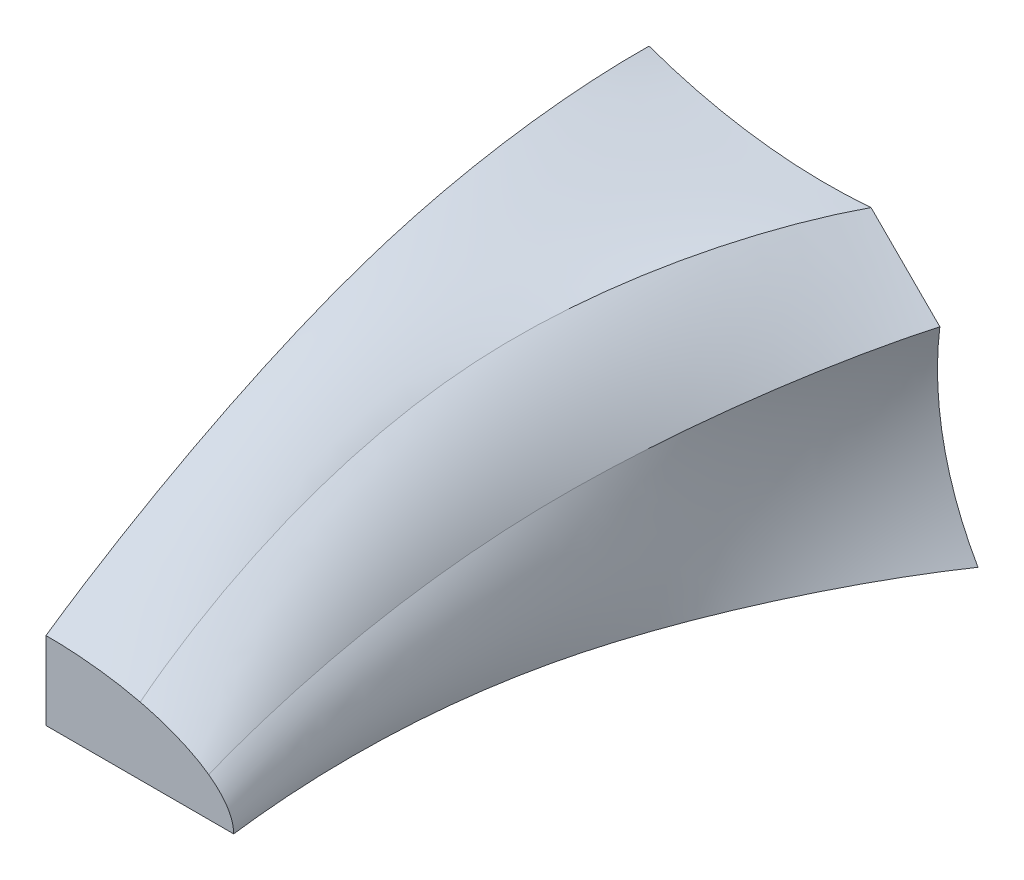
ISO-10303-21;
HEADER;
FILE_DESCRIPTION(('STEP AP214'),'2;1');
FILE_NAME('part.step','',(''),(''),'','','');
FILE_SCHEMA(('AUTOMOTIVE_DESIGN { 1 0 10303 214 1 1 1 1 }'));
ENDSEC;
DATA;
#1=APPLICATION_CONTEXT('core data for automotive mechanical design processes');
#2=APPLICATION_PROTOCOL_DEFINITION('international standard','automotive_design',2000,#1);
#3=PRODUCT_CONTEXT('',#1,'mechanical');
#4=PRODUCT('Part','Part','',(#3));
#5=PRODUCT_RELATED_PRODUCT_CATEGORY('part','',(#4));
#6=PRODUCT_DEFINITION_FORMATION('','',#4);
#7=PRODUCT_DEFINITION_CONTEXT('part definition',#1,'design');
#8=PRODUCT_DEFINITION('design','',#6,#7);
#9=PRODUCT_DEFINITION_SHAPE('','',#8);
#10=(LENGTH_UNIT() NAMED_UNIT(*) SI_UNIT(.MILLI.,.METRE.));
#11=(NAMED_UNIT(*) PLANE_ANGLE_UNIT() SI_UNIT($,.RADIAN.));
#12=(NAMED_UNIT(*) SI_UNIT($,.STERADIAN.) SOLID_ANGLE_UNIT());
#13=UNCERTAINTY_MEASURE_WITH_UNIT(LENGTH_MEASURE(1.E-05),#10,'distance_accuracy_value','');
#14=(GEOMETRIC_REPRESENTATION_CONTEXT(3) GLOBAL_UNCERTAINTY_ASSIGNED_CONTEXT((#13)) GLOBAL_UNIT_ASSIGNED_CONTEXT((#10,
#11,#12)) REPRESENTATION_CONTEXT('',''));
#15=CARTESIAN_POINT('',(0.,0.,0.));
#16=DIRECTION('',(0.,0.,1.));
#17=DIRECTION('',(1.,0.,0.));
#18=AXIS2_PLACEMENT_3D('',#15,#16,#17);
#19=CARTESIAN_POINT('',(0.,0.,82.55));
#20=DIRECTION('',(0.,0.,1.));
#21=DIRECTION('',(1.,0.,0.));
#22=AXIS2_PLACEMENT_3D('',#19,#20,#21);
#23=PLANE('',#22);
#24=DIRECTION('',(0.,-1.,0.));
#25=VECTOR('',#24,1.);
#26=CARTESIAN_POINT('',(0.,0.,82.55));
#27=LINE('',#26,#25);
#28=CARTESIAN_POINT('',(0.,10.6743821804045,82.55));
#29=VERTEX_POINT('',#28);
#30=CARTESIAN_POINT('',(0.,0.,82.55));
#31=VERTEX_POINT('',#30);
#32=EDGE_CURVE('E138',#29,#31,#27,.T.);
#33=ORIENTED_EDGE('',*,*,#32,.T.);
#34=DIRECTION('',(1.,0.,0.));
#35=VECTOR('',#34,1.);
#36=CARTESIAN_POINT('',(0.,0.,82.55));
#37=LINE('',#36,#35);
#38=CARTESIAN_POINT('',(25.6911417861589,0.,82.55));
#39=VERTEX_POINT('',#38);
#40=EDGE_CURVE('E218',#31,#39,#37,.T.);
#41=ORIENTED_EDGE('',*,*,#40,.T.);
#42=CARTESIAN_POINT('',(0.,0.,82.55));
#43=DIRECTION('',(0.,0.,1.));
#44=DIRECTION('',(1.,0.,0.));
#45=AXIS2_PLACEMENT_3D('',#42,#43,#44);
#46=ELLIPSE('',#45,25.6911417861589,10.6743821804045);
#47=CARTESIAN_POINT('',(22.2634632933464,5.32689996559936,82.55));
#48=VERTEX_POINT('',#47);
#49=EDGE_CURVE('E112',#39,#48,#46,.T.);
#50=ORIENTED_EDGE('',*,*,#49,.T.);
#51=CARTESIAN_POINT('',(12.8950605663748,9.23238389625349,82.55));
#52=VERTEX_POINT('',#51);
#53=EDGE_CURVE('E115',#48,#52,#46,.T.);
#54=ORIENTED_EDGE('',*,*,#53,.T.);
#55=EDGE_CURVE('E119',#52,#29,#46,.T.);
#56=ORIENTED_EDGE('',*,*,#55,.T.);
#57=EDGE_LOOP('',(#33,#41,#50,#54,#56));
#58=FACE_BOUND('',#57,.T.);
#59=ADVANCED_FACE('F66',(#58),#23,.T.);
#60=CARTESIAN_POINT('',(24.3319668312913,107.655299062586,0.));
#61=DIRECTION('',(0.,0.,1.));
#62=DIRECTION('',(1.,0.,0.));
#63=AXIS2_PLACEMENT_3D('',#60,#61,#62);
#64=PLANE('',#63);
#65=CARTESIAN_POINT('',(24.3319668312913,107.655299062586,0.));
#66=DIRECTION('',(0.,0.,-1.));
#67=DIRECTION('',(1.,0.,0.));
#68=AXIS2_PLACEMENT_3D('',#65,#66,#67);
#69=CIRCLE('',#68,72.5807472209943);
#70=CARTESIAN_POINT('',(30.3860838751481,35.3274860583401,0.));
#71=VERTEX_POINT('',#70);
#72=CARTESIAN_POINT('',(0.,39.2745981501295,0.));
#73=VERTEX_POINT('',#72);
#74=EDGE_CURVE('E166',#71,#73,#69,.T.);
#75=ORIENTED_EDGE('',*,*,#74,.F.);
#76=DIRECTION('',(-0.70708390454535,0.707129657087654,0.));
#77=VECTOR('',#76,1.);
#78=CARTESIAN_POINT('',(30.3860838751481,35.3274860583401,0.));
#79=LINE('',#78,#77);
#80=CARTESIAN_POINT('',(39.8062561381852,25.9067042540206,0.));
#81=VERTEX_POINT('',#80);
#82=EDGE_CURVE('E144',#81,#71,#79,.T.);
#83=ORIENTED_EDGE('',*,*,#82,.F.);
#84=CARTESIAN_POINT('',(80.89226061745,20.7088529487753,0.));
#85=DIRECTION('',(0.,0.,-1.));
#86=DIRECTION('',(1.,0.,0.));
#87=AXIS2_PLACEMENT_3D('',#84,#85,#86);
#88=CIRCLE('',#87,41.4134932390592);
#89=CARTESIAN_POINT('',(45.028339585198,0.,0.));
#90=VERTEX_POINT('',#89);
#91=EDGE_CURVE('E250',#90,#81,#88,.T.);
#92=ORIENTED_EDGE('',*,*,#91,.F.);
#93=DIRECTION('',(1.,0.,0.));
#94=VECTOR('',#93,1.);
#95=CARTESIAN_POINT('',(0.,0.,0.));
#96=LINE('',#95,#94);
#97=CARTESIAN_POINT('',(0.,0.,0.));
#98=VERTEX_POINT('',#97);
#99=EDGE_CURVE('E77',#98,#90,#96,.T.);
#100=ORIENTED_EDGE('',*,*,#99,.F.);
#101=DIRECTION('',(0.,-1.,0.));
#102=VECTOR('',#101,1.);
#103=CARTESIAN_POINT('',(0.,0.,0.));
#104=LINE('',#103,#102);
#105=EDGE_CURVE('E12',#73,#98,#104,.T.);
#106=ORIENTED_EDGE('',*,*,#105,.F.);
#107=EDGE_LOOP('',(#75,#83,#92,#100,#106));
#108=FACE_BOUND('',#107,.T.);
#109=ADVANCED_FACE('F286',(#108),#64,.F.);
#110=CARTESIAN_POINT('',(45.028339585198,0.,0.));
#111=CARTESIAN_POINT('',(39.4516631415439,0.,8.05703448881319));
#112=CARTESIAN_POINT('',(22.5126293143968,0.,40.7797738145076));
#113=CARTESIAN_POINT('',(24.411620408958,0.,72.2625900443687));
#114=CARTESIAN_POINT('',(25.6911417861589,0.,82.55));
#115=CARTESIAN_POINT('',(40.5052113873424,7.83322537988466,0.));
#116=CARTESIAN_POINT('',(35.1109059369786,7.13140363113995,8.08520068010766));
#117=CARTESIAN_POINT('',(25.0073824724487,6.13449248923007,40.7512994144839));
#118=CARTESIAN_POINT('',(24.461072516752,2.69226909411327,72.2907562356632));
#119=CARTESIAN_POINT('',(25.6911417861589,1.86966089556751,82.55));
#120=CARTESIAN_POINT('',(38.6709664210207,16.9328964889519,0.));
#121=CARTESIAN_POINT('',(33.4590319639472,15.5292529914625,8.11336687140213));
#122=CARTESIAN_POINT('',(24.0191103565009,11.3599865003393,40.7228250144602));
#123=CARTESIAN_POINT('',(23.3284611073887,5.35190317536194,72.3189224269577));
#124=CARTESIAN_POINT('',(24.5090782690018,3.70668677827042,82.55));
#125=CARTESIAN_POINT('',(39.8062561381852,25.9067042540206,0.));
#126=CARTESIAN_POINT('',(34.7766926744019,23.8012390077865,8.1415330626966));
#127=CARTESIAN_POINT('',(19.5652344951222,15.4953193402274,40.6943506144365));
#128=CARTESIAN_POINT('',(21.1322982395273,7.79472456123665,72.3470886182521));
#129=CARTESIAN_POINT('',(22.2634632933464,5.32689996559936,82.55));
#130=B_SPLINE_SURFACE_WITH_KNOTS('',3,3,((#110,#111,#112,#113,#114),(#115,#116,#117,#118,#119),
(#120,#121,#122,#123,#124),(#125,#126,#127,#128,#129)),.UNSPECIFIED.,.F.,.F.,.F.,(4,4),(4,1,4),
(0.,1.),(0.,0.463116800946352,1.),.UNSPECIFIED.);
#131=CARTESIAN_POINT('',(39.8062561381852,25.9067042540206,0.));
#132=CARTESIAN_POINT('',(34.7766926744019,23.8012390077865,8.1415330626966));
#133=CARTESIAN_POINT('',(19.5652344951222,15.4953193402274,40.6943506144365));
#134=CARTESIAN_POINT('',(21.1322982395273,7.79472456123665,72.3470886182521));
#135=CARTESIAN_POINT('',(22.2634632933464,5.32689996559936,82.55));
#136=B_SPLINE_CURVE_WITH_KNOTS('',3,(#131,#132,#133,#134,#135),.UNSPECIFIED.,.F.,.F.,(4,1,4),
(0.,0.463116800946352,1.),.UNSPECIFIED.);
#137=EDGE_CURVE('E149',#81,#48,#136,.T.);
#138=CARTESIAN_POINT('',(45.028339585198,0.,0.));
#139=CARTESIAN_POINT('',(39.4516631415439,0.,8.05703448881319));
#140=CARTESIAN_POINT('',(22.5126293143968,0.,40.7797738145076));
#141=CARTESIAN_POINT('',(24.411620408958,0.,72.2625900443687));
#142=CARTESIAN_POINT('',(25.6911417861589,0.,82.55));
#143=B_SPLINE_CURVE_WITH_KNOTS('',3,(#138,#139,#140,#141,#142),.UNSPECIFIED.,.F.,.F.,(4,1,4),
(0.,0.463116800946352,1.),.UNSPECIFIED.);
#144=EDGE_CURVE('E146',#39,#90,#143,.F.);
#145=ORIENTED_EDGE('',*,*,#91,.T.);
#146=ORIENTED_EDGE('',*,*,#137,.T.);
#147=ORIENTED_EDGE('',*,*,#49,.F.);
#148=ORIENTED_EDGE('',*,*,#144,.T.);
#149=EDGE_LOOP('',(#145,#146,#147,#148));
#150=FACE_BOUND('',#149,.T.);
#151=ADVANCED_FACE('F245',(#150),#130,.T.);
#152=CARTESIAN_POINT('',(39.8062561381852,25.9067042540206,0.));
#153=CARTESIAN_POINT('',(34.7766926744019,23.8012390077865,8.1415330626966));
#154=CARTESIAN_POINT('',(19.5652344951222,15.4953193402274,40.6943506144365));
#155=CARTESIAN_POINT('',(21.1322982395273,7.79472456123665,72.3470886182521));
#156=CARTESIAN_POINT('',(22.2634632933464,5.32689996559936,82.55));
#157=CARTESIAN_POINT('',(36.6661987171728,29.0469648554604,0.));
#158=CARTESIAN_POINT('',(31.5765884282401,27.5048770515611,8.24851457628638));
#159=CARTESIAN_POINT('',(17.7789225156026,22.2142575743207,40.5861984549469));
#160=CARTESIAN_POINT('',(18.8228016582731,10.3868557741348,72.4540701318419));
#161=CARTESIAN_POINT('',(20.017848317691,6.94711315292831,82.55));
#162=CARTESIAN_POINT('',(33.5261412961605,32.1872254569002,0.));
#163=CARTESIAN_POINT('',(28.3764841820783,31.2085150953356,8.35549608987617));
#164=CARTESIAN_POINT('',(14.3678206077736,27.4643026645128,40.4780462954572));
#165=CARTESIAN_POINT('',(15.528148234136,12.7056125072871,72.5610516454317));
#166=CARTESIAN_POINT('',(16.7870764991526,8.29395186051134,82.55));
#167=CARTESIAN_POINT('',(30.3860838751481,35.3274860583401,0.));
#168=CARTESIAN_POINT('',(25.1763799359165,34.9121531391102,8.46247760346595));
#169=CARTESIAN_POINT('',(9.82737490839879,30.5061323671282,40.3698941359676));
#170=CARTESIAN_POINT('',(11.5722506957594,14.6159625685985,72.6680331590215));
#171=CARTESIAN_POINT('',(12.8950605663748,9.23238389625349,82.55));
#172=B_SPLINE_SURFACE_WITH_KNOTS('',3,3,((#152,#153,#154,#155,#156),(#157,#158,#159,#160,#161),
(#162,#163,#164,#165,#166),(#167,#168,#169,#170,#171)),.UNSPECIFIED.,.F.,.F.,.F.,(4,4),(4,1,4),
(0.,1.),(0.,0.463116800946352,1.),.UNSPECIFIED.);
#173=CARTESIAN_POINT('',(30.3860838751481,35.3274860583401,0.));
#174=CARTESIAN_POINT('',(25.1763799359165,34.9121531391102,8.46247760346595));
#175=CARTESIAN_POINT('',(9.82737490839879,30.5061323671282,40.3698941359676));
#176=CARTESIAN_POINT('',(11.5722506957594,14.6159625685985,72.6680331590215));
#177=CARTESIAN_POINT('',(12.8950605663748,9.23238389625349,82.55));
#178=B_SPLINE_CURVE_WITH_KNOTS('',3,(#173,#174,#175,#176,#177),.UNSPECIFIED.,.F.,.F.,(4,1,4),
(0.,0.463116800946352,1.),.UNSPECIFIED.);
#179=EDGE_CURVE('E135',#71,#52,#178,.T.);
#180=ORIENTED_EDGE('',*,*,#82,.T.);
#181=ORIENTED_EDGE('',*,*,#179,.T.);
#182=ORIENTED_EDGE('',*,*,#53,.F.);
#183=ORIENTED_EDGE('',*,*,#137,.F.);
#184=EDGE_LOOP('',(#180,#181,#182,#183));
#185=FACE_BOUND('',#184,.T.);
#186=ADVANCED_FACE('F142',(#185),#172,.T.);
#187=CARTESIAN_POINT('',(0.,0.,0.));
#188=DIRECTION('',(0.,-1.,0.));
#189=DIRECTION('',(1.,0.,0.));
#190=AXIS2_PLACEMENT_3D('',#187,#188,#189);
#191=PLANE('',#190);
#192=ORIENTED_EDGE('',*,*,#99,.T.);
#193=ORIENTED_EDGE('',*,*,#144,.F.);
#194=ORIENTED_EDGE('',*,*,#40,.F.);
#195=DIRECTION('',(0.,0.,1.));
#196=VECTOR('',#195,1.);
#197=CARTESIAN_POINT('',(0.,0.,41.6497003283609));
#198=LINE('',#197,#196);
#199=EDGE_CURVE('E151',#98,#31,#198,.T.);
#200=ORIENTED_EDGE('',*,*,#199,.F.);
#201=EDGE_LOOP('',(#192,#193,#194,#200));
#202=FACE_BOUND('',#201,.T.);
#203=ADVANCED_FACE('F184',(#202),#191,.T.);
#204=CARTESIAN_POINT('',(30.3860838751482,35.3274860583401,0.));
#205=CARTESIAN_POINT('',(25.1763799359165,34.9121531391102,8.46247760346595));
#206=CARTESIAN_POINT('',(9.82737490839879,30.5061323671282,40.3698941359676));
#207=CARTESIAN_POINT('',(11.5722506957594,14.6159625685985,72.6680331590215));
#208=CARTESIAN_POINT('',(12.8950605663748,9.23238389625349,82.55));
#209=CARTESIAN_POINT('',(20.0922022929628,34.4658484483311,0.));
#210=CARTESIAN_POINT('',(16.6190663334751,34.2322101786252,8.63073319062568));
#211=CARTESIAN_POINT('',(7.45071425483654,36.8922182464265,40.1997974109642));
#212=CARTESIAN_POINT('',(8.09602220563312,15.9277171400271,72.8362887461812));
#213=CARTESIAN_POINT('',(8.97789545271003,10.1768798324073,82.55));
#214=CARTESIAN_POINT('',(9.7321183713703,35.8116096423992,0.));
#215=CARTESIAN_POINT('',(7.99555039162641,35.7596660222171,8.79898877778542));
#216=CARTESIAN_POINT('',(3.99227544662175,39.1080219814118,40.0297006859608));
#217=CARTESIAN_POINT('',(4.08804721821586,16.7924781232992,73.004544333341));
#218=CARTESIAN_POINT('',(4.52898384175432,10.6743821804045,82.55));
#219=CARTESIAN_POINT('',(0.,39.2745981501295,0.));
#220=CARTESIAN_POINT('',(0.,39.4043491794713,8.96724436494515));
#221=CARTESIAN_POINT('',(0.,36.8370141826916,39.8596039609574));
#222=CARTESIAN_POINT('',(0.,17.1597367585741,73.1727999205007));
#223=CARTESIAN_POINT('',(0.,10.6743821804045,82.55));
#224=B_SPLINE_SURFACE_WITH_KNOTS('',3,3,((#204,#205,#206,#207,#208),(#209,#210,#211,#212,#213),
(#214,#215,#216,#217,#218),(#219,#220,#221,#222,#223)),.UNSPECIFIED.,.F.,.F.,.F.,(4,4),(4,1,4),
(0.,1.),(0.,0.463116800946352,1.),.UNSPECIFIED.);
#225=CARTESIAN_POINT('',(0.,39.2745981501295,0.));
#226=CARTESIAN_POINT('',(0.,39.4043491794713,8.96724436494515));
#227=CARTESIAN_POINT('',(0.,36.8370141826916,39.8596039609574));
#228=CARTESIAN_POINT('',(0.,17.1597367585741,73.1727999205007));
#229=CARTESIAN_POINT('',(0.,10.6743821804045,82.55));
#230=B_SPLINE_CURVE_WITH_KNOTS('',3,(#225,#226,#227,#228,#229),.UNSPECIFIED.,.F.,.F.,(4,1,4),
(0.,0.463116800946352,1.),.UNSPECIFIED.);
#231=EDGE_CURVE('E137',#73,#29,#230,.T.);
#232=ORIENTED_EDGE('',*,*,#74,.T.);
#233=ORIENTED_EDGE('',*,*,#231,.T.);
#234=ORIENTED_EDGE('',*,*,#55,.F.);
#235=ORIENTED_EDGE('',*,*,#179,.F.);
#236=EDGE_LOOP('',(#232,#233,#234,#235));
#237=FACE_BOUND('',#236,.T.);
#238=ADVANCED_FACE('F134',(#237),#224,.T.);
#239=CARTESIAN_POINT('',(0.,39.2745981501295,0.));
#240=DIRECTION('',(-1.,0.,0.));
#241=DIRECTION('',(0.,-1.,0.));
#242=AXIS2_PLACEMENT_3D('',#239,#240,#241);
#243=PLANE('',#242);
#244=ORIENTED_EDGE('',*,*,#105,.T.);
#245=ORIENTED_EDGE('',*,*,#199,.T.);
#246=ORIENTED_EDGE('',*,*,#32,.F.);
#247=ORIENTED_EDGE('',*,*,#231,.F.);
#248=EDGE_LOOP('',(#244,#245,#246,#247));
#249=FACE_BOUND('',#248,.T.);
#250=ADVANCED_FACE('F183',(#249),#243,.T.);
#251=CLOSED_SHELL('',(#59,#109,#151,#186,#203,#238,#250));
#252=MANIFOLD_SOLID_BREP('B2',#251);
#253=ADVANCED_BREP_SHAPE_REPRESENTATION('',(#18,#252),#14);
#254=SHAPE_DEFINITION_REPRESENTATION(#9,#253);
ENDSEC;
END-ISO-10303-21;
